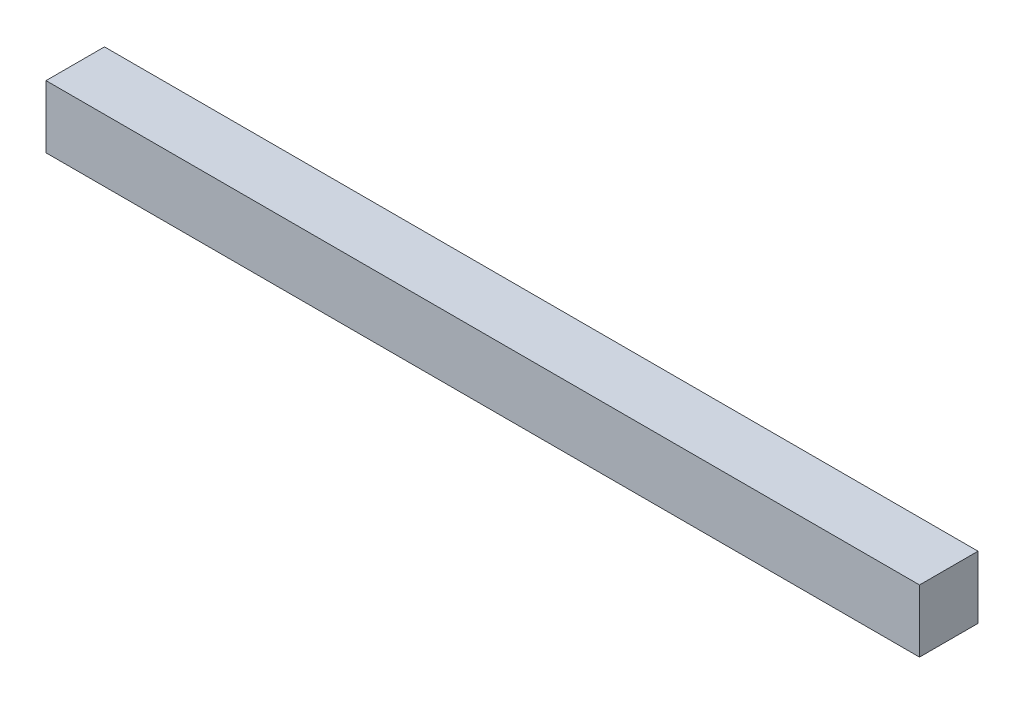
ISO-10303-21;
HEADER;
FILE_DESCRIPTION(('STEP AP214'),'2;1');
FILE_NAME('part.step','',(''),(''),'','','');
FILE_SCHEMA(('AUTOMOTIVE_DESIGN { 1 0 10303 214 1 1 1 1 }'));
ENDSEC;
DATA;
#1=APPLICATION_CONTEXT('core data for automotive mechanical design processes');
#2=APPLICATION_PROTOCOL_DEFINITION('international standard','automotive_design',2000,#1);
#3=PRODUCT_CONTEXT('',#1,'mechanical');
#4=PRODUCT('Part','Part','',(#3));
#5=PRODUCT_RELATED_PRODUCT_CATEGORY('part','',(#4));
#6=PRODUCT_DEFINITION_FORMATION('','',#4);
#7=PRODUCT_DEFINITION_CONTEXT('part definition',#1,'design');
#8=PRODUCT_DEFINITION('design','',#6,#7);
#9=PRODUCT_DEFINITION_SHAPE('','',#8);
#10=(LENGTH_UNIT() NAMED_UNIT(*) SI_UNIT(.MILLI.,.METRE.));
#11=(NAMED_UNIT(*) PLANE_ANGLE_UNIT() SI_UNIT($,.RADIAN.));
#12=(NAMED_UNIT(*) SI_UNIT($,.STERADIAN.) SOLID_ANGLE_UNIT());
#13=UNCERTAINTY_MEASURE_WITH_UNIT(LENGTH_MEASURE(1.E-05),#10,'distance_accuracy_value','');
#14=(GEOMETRIC_REPRESENTATION_CONTEXT(3) GLOBAL_UNCERTAINTY_ASSIGNED_CONTEXT((#13)) GLOBAL_UNIT_ASSIGNED_CONTEXT((#10,
#11,#12)) REPRESENTATION_CONTEXT('',''));
#15=CARTESIAN_POINT('',(0.,0.,0.));
#16=DIRECTION('',(0.,0.,1.));
#17=DIRECTION('',(1.,0.,0.));
#18=AXIS2_PLACEMENT_3D('',#15,#16,#17);
#19=CARTESIAN_POINT('',(-526.698167592016,-29.3759143229693,10.));
#20=DIRECTION('',(0.,-1.,0.));
#21=DIRECTION('',(0.,0.,-1.));
#22=AXIS2_PLACEMENT_3D('',#19,#20,#21);
#23=PLANE('',#22);
#24=DIRECTION('',(-1.,0.,0.));
#25=VECTOR('',#24,1.);
#26=CARTESIAN_POINT('',(-526.698167592016,-29.3759143229693,0.));
#27=LINE('',#26,#25);
#28=CARTESIAN_POINT('',(-377.304646719679,-29.3759143229693,0.));
#29=VERTEX_POINT('',#28);
#30=CARTESIAN_POINT('',(-526.698167592016,-29.3759143229693,0.));
#31=VERTEX_POINT('',#30);
#32=EDGE_CURVE('E98',#29,#31,#27,.T.);
#33=ORIENTED_EDGE('',*,*,#32,.T.);
#34=DIRECTION('',(0.,0.,-1.));
#35=VECTOR('',#34,1.);
#36=CARTESIAN_POINT('',(-526.698167592016,-29.3759143229693,10.));
#37=LINE('',#36,#35);
#38=CARTESIAN_POINT('',(-526.698167592016,-29.3759143229693,10.));
#39=VERTEX_POINT('',#38);
#40=EDGE_CURVE('E11',#39,#31,#37,.T.);
#41=ORIENTED_EDGE('',*,*,#40,.F.);
#42=DIRECTION('',(-1.,0.,0.));
#43=VECTOR('',#42,1.);
#44=CARTESIAN_POINT('',(-526.698167592016,-29.3759143229693,10.));
#45=LINE('',#44,#43);
#46=CARTESIAN_POINT('',(-377.304646719679,-29.3759143229693,10.));
#47=VERTEX_POINT('',#46);
#48=EDGE_CURVE('E86',#47,#39,#45,.T.);
#49=ORIENTED_EDGE('',*,*,#48,.F.);
#50=DIRECTION('',(0.,0.,-1.));
#51=VECTOR('',#50,1.);
#52=CARTESIAN_POINT('',(-377.304646719679,-29.3759143229693,10.));
#53=LINE('',#52,#51);
#54=EDGE_CURVE('E94',#47,#29,#53,.T.);
#55=ORIENTED_EDGE('',*,*,#54,.T.);
#56=EDGE_LOOP('',(#33,#41,#49,#55));
#57=FACE_BOUND('',#56,.T.);
#58=ADVANCED_FACE('F35',(#57),#23,.F.);
#59=CARTESIAN_POINT('',(-526.698167592016,-29.3759143229693,10.));
#60=DIRECTION('',(1.,0.,0.));
#61=DIRECTION('',(0.,0.,-1.));
#62=AXIS2_PLACEMENT_3D('',#59,#60,#61);
#63=PLANE('',#62);
#64=DIRECTION('',(0.,-1.,0.));
#65=VECTOR('',#64,1.);
#66=CARTESIAN_POINT('',(-526.698167592016,-29.3759143229693,0.));
#67=LINE('',#66,#65);
#68=CARTESIAN_POINT('',(-526.698167592016,-40.0708674380894,0.));
#69=VERTEX_POINT('',#68);
#70=EDGE_CURVE('E90',#31,#69,#67,.T.);
#71=ORIENTED_EDGE('',*,*,#70,.T.);
#72=DIRECTION('',(0.,0.,-1.));
#73=VECTOR('',#72,1.);
#74=CARTESIAN_POINT('',(-526.698167592016,-40.0708674380894,10.));
#75=LINE('',#74,#73);
#76=CARTESIAN_POINT('',(-526.698167592016,-40.0708674380894,10.));
#77=VERTEX_POINT('',#76);
#78=EDGE_CURVE('E43',#77,#69,#75,.T.);
#79=ORIENTED_EDGE('',*,*,#78,.F.);
#80=DIRECTION('',(0.,-1.,0.));
#81=VECTOR('',#80,1.);
#82=CARTESIAN_POINT('',(-526.698167592016,-29.3759143229693,10.));
#83=LINE('',#82,#81);
#84=EDGE_CURVE('E81',#39,#77,#83,.T.);
#85=ORIENTED_EDGE('',*,*,#84,.F.);
#86=ORIENTED_EDGE('',*,*,#40,.T.);
#87=EDGE_LOOP('',(#71,#79,#85,#86));
#88=FACE_BOUND('',#87,.T.);
#89=ADVANCED_FACE('F89',(#88),#63,.F.);
#90=CARTESIAN_POINT('',(-526.698167592016,-40.0708674380894,10.));
#91=DIRECTION('',(0.,1.,0.));
#92=DIRECTION('',(0.,0.,1.));
#93=AXIS2_PLACEMENT_3D('',#90,#91,#92);
#94=PLANE('',#93);
#95=DIRECTION('',(1.,0.,0.));
#96=VECTOR('',#95,1.);
#97=CARTESIAN_POINT('',(-526.698167592016,-40.0708674380894,0.));
#98=LINE('',#97,#96);
#99=CARTESIAN_POINT('',(-377.304646719679,-40.0708674380894,0.));
#100=VERTEX_POINT('',#99);
#101=EDGE_CURVE('E68',#69,#100,#98,.T.);
#102=ORIENTED_EDGE('',*,*,#101,.T.);
#103=DIRECTION('',(0.,0.,-1.));
#104=VECTOR('',#103,1.);
#105=CARTESIAN_POINT('',(-377.304646719679,-40.0708674380894,10.));
#106=LINE('',#105,#104);
#107=CARTESIAN_POINT('',(-377.304646719679,-40.0708674380894,10.));
#108=VERTEX_POINT('',#107);
#109=EDGE_CURVE('E91',#108,#100,#106,.T.);
#110=ORIENTED_EDGE('',*,*,#109,.F.);
#111=DIRECTION('',(1.,0.,0.));
#112=VECTOR('',#111,1.);
#113=CARTESIAN_POINT('',(-526.698167592016,-40.0708674380894,10.));
#114=LINE('',#113,#112);
#115=EDGE_CURVE('E84',#77,#108,#114,.T.);
#116=ORIENTED_EDGE('',*,*,#115,.F.);
#117=ORIENTED_EDGE('',*,*,#78,.T.);
#118=EDGE_LOOP('',(#102,#110,#116,#117));
#119=FACE_BOUND('',#118,.T.);
#120=ADVANCED_FACE('F92',(#119),#94,.F.);
#121=CARTESIAN_POINT('',(-377.304646719679,-29.3759143229693,10.));
#122=DIRECTION('',(-1.,0.,0.));
#123=DIRECTION('',(0.,0.,1.));
#124=AXIS2_PLACEMENT_3D('',#121,#122,#123);
#125=PLANE('',#124);
#126=DIRECTION('',(0.,1.,0.));
#127=VECTOR('',#126,1.);
#128=CARTESIAN_POINT('',(-377.304646719679,-29.3759143229693,0.));
#129=LINE('',#128,#127);
#130=EDGE_CURVE('E74',#100,#29,#129,.T.);
#131=ORIENTED_EDGE('',*,*,#130,.T.);
#132=ORIENTED_EDGE('',*,*,#54,.F.);
#133=DIRECTION('',(0.,1.,0.));
#134=VECTOR('',#133,1.);
#135=CARTESIAN_POINT('',(-377.304646719679,-29.3759143229693,10.));
#136=LINE('',#135,#134);
#137=EDGE_CURVE('E51',#108,#47,#136,.T.);
#138=ORIENTED_EDGE('',*,*,#137,.F.);
#139=ORIENTED_EDGE('',*,*,#109,.T.);
#140=EDGE_LOOP('',(#131,#132,#138,#139));
#141=FACE_BOUND('',#140,.T.);
#142=ADVANCED_FACE('F105',(#141),#125,.F.);
#143=CARTESIAN_POINT('',(0.,0.,10.));
#144=DIRECTION('',(0.,0.,-1.));
#145=DIRECTION('',(-1.,0.,0.));
#146=AXIS2_PLACEMENT_3D('',#143,#144,#145);
#147=PLANE('',#146);
#148=ORIENTED_EDGE('',*,*,#48,.T.);
#149=ORIENTED_EDGE('',*,*,#84,.T.);
#150=ORIENTED_EDGE('',*,*,#115,.T.);
#151=ORIENTED_EDGE('',*,*,#137,.T.);
#152=EDGE_LOOP('',(#148,#149,#150,#151));
#153=FACE_BOUND('',#152,.T.);
#154=ADVANCED_FACE('F82',(#153),#147,.F.);
#155=CARTESIAN_POINT('',(0.,0.,0.));
#156=DIRECTION('',(0.,0.,-1.));
#157=DIRECTION('',(-1.,0.,0.));
#158=AXIS2_PLACEMENT_3D('',#155,#156,#157);
#159=PLANE('',#158);
#160=ORIENTED_EDGE('',*,*,#32,.F.);
#161=ORIENTED_EDGE('',*,*,#130,.F.);
#162=ORIENTED_EDGE('',*,*,#101,.F.);
#163=ORIENTED_EDGE('',*,*,#70,.F.);
#164=EDGE_LOOP('',(#160,#161,#162,#163));
#165=FACE_BOUND('',#164,.T.);
#166=ADVANCED_FACE('F108',(#165),#159,.T.);
#167=CLOSED_SHELL('',(#58,#89,#120,#142,#154,#166));
#168=MANIFOLD_SOLID_BREP('B2',#167);
#169=ADVANCED_BREP_SHAPE_REPRESENTATION('',(#18,#168),#14);
#170=SHAPE_DEFINITION_REPRESENTATION(#9,#169);
ENDSEC;
END-ISO-10303-21;
